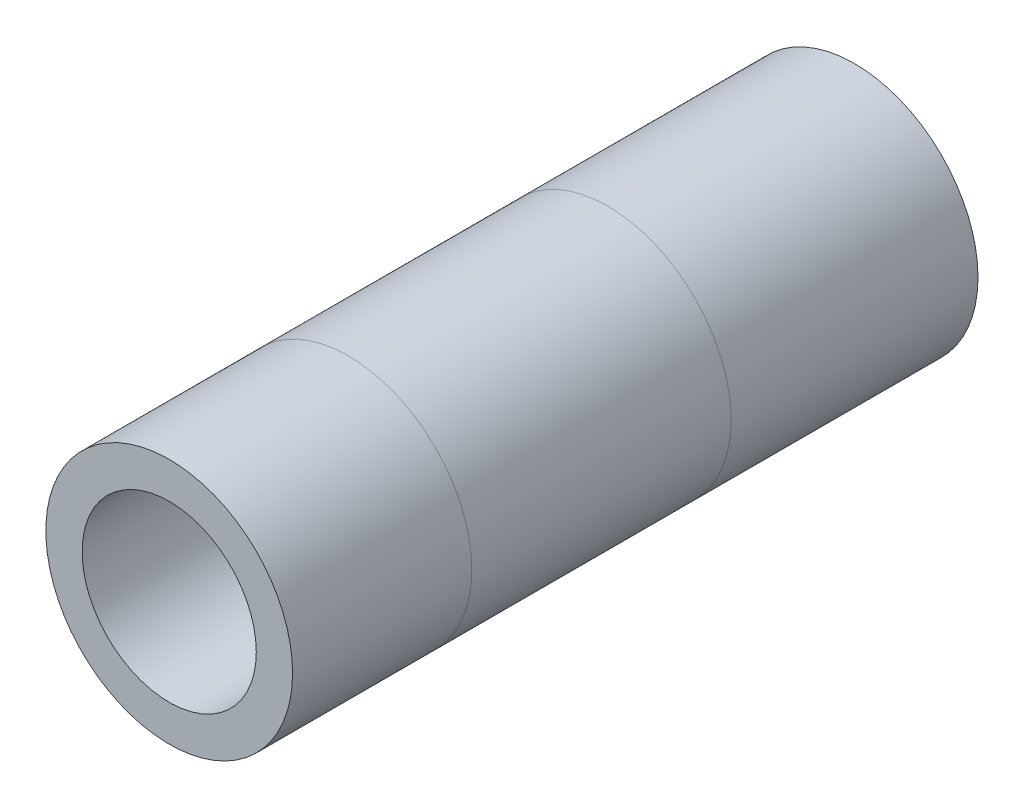
ISO-10303-21;
HEADER;
FILE_DESCRIPTION(('STEP AP214'),'2;1');
FILE_NAME('part.step','',(''),(''),'','','');
FILE_SCHEMA(('AUTOMOTIVE_DESIGN { 1 0 10303 214 1 1 1 1 }'));
ENDSEC;
DATA;
#1=APPLICATION_CONTEXT('core data for automotive mechanical design processes');
#2=APPLICATION_PROTOCOL_DEFINITION('international standard','automotive_design',2000,#1);
#3=PRODUCT_CONTEXT('',#1,'mechanical');
#4=PRODUCT('Part','Part','',(#3));
#5=PRODUCT_RELATED_PRODUCT_CATEGORY('part','',(#4));
#6=PRODUCT_DEFINITION_FORMATION('','',#4);
#7=PRODUCT_DEFINITION_CONTEXT('part definition',#1,'design');
#8=PRODUCT_DEFINITION('design','',#6,#7);
#9=PRODUCT_DEFINITION_SHAPE('','',#8);
#10=(LENGTH_UNIT() NAMED_UNIT(*) SI_UNIT(.MILLI.,.METRE.));
#11=(NAMED_UNIT(*) PLANE_ANGLE_UNIT() SI_UNIT($,.RADIAN.));
#12=(NAMED_UNIT(*) SI_UNIT($,.STERADIAN.) SOLID_ANGLE_UNIT());
#13=UNCERTAINTY_MEASURE_WITH_UNIT(LENGTH_MEASURE(1.E-05),#10,'distance_accuracy_value','');
#14=(GEOMETRIC_REPRESENTATION_CONTEXT(3) GLOBAL_UNCERTAINTY_ASSIGNED_CONTEXT((#13)) GLOBAL_UNIT_ASSIGNED_CONTEXT((#10,
#11,#12)) REPRESENTATION_CONTEXT('',''));
#15=CARTESIAN_POINT('',(0.,0.,0.));
#16=DIRECTION('',(0.,0.,1.));
#17=DIRECTION('',(1.,0.,0.));
#18=AXIS2_PLACEMENT_3D('',#15,#16,#17);
#19=CARTESIAN_POINT('',(23.5000000000002,72.9999999999999,-27.));
#20=DIRECTION('',(0.,0.,1.));
#21=DIRECTION('',(1.,0.,0.));
#22=AXIS2_PLACEMENT_3D('',#19,#20,#21);
#23=PLANE('',#22);
#24=CARTESIAN_POINT('',(23.5000000000002,72.9999999999999,-27.));
#25=DIRECTION('',(0.,0.,1.));
#26=DIRECTION('',(1.,0.,0.));
#27=AXIS2_PLACEMENT_3D('',#24,#25,#26);
#28=CIRCLE('',#27,9.525);
#29=CARTESIAN_POINT('',(33.0250000000002,72.9999999999999,-27.));
#30=VERTEX_POINT('',#29);
#31=EDGE_CURVE('E85',#30,#30,#28,.F.);
#32=ORIENTED_EDGE('',*,*,#31,.F.);
#33=EDGE_LOOP('',(#32));
#34=FACE_BOUND('',#33,.T.);
#35=CARTESIAN_POINT('',(23.5000000000002,72.9999999999999,-27.));
#36=DIRECTION('',(0.,0.,1.));
#37=DIRECTION('',(1.,0.,0.));
#38=AXIS2_PLACEMENT_3D('',#35,#36,#37);
#39=CIRCLE('',#38,13.49375);
#40=CARTESIAN_POINT('',(36.9937500000002,72.9999999999999,-27.));
#41=VERTEX_POINT('',#40);
#42=EDGE_CURVE('E63',#41,#41,#39,.T.);
#43=ORIENTED_EDGE('',*,*,#42,.F.);
#44=EDGE_LOOP('',(#43));
#45=FACE_BOUND('',#44,.T.);
#46=ADVANCED_FACE('F60',(#34,#45),#23,.F.);
#47=CARTESIAN_POINT('',(23.5000000000001,72.9999999914589,47.9735795162963));
#48=DIRECTION('',(0.,0.,1.));
#49=DIRECTION('',(1.,0.,0.));
#50=AXIS2_PLACEMENT_3D('',#47,#48,#49);
#51=PLANE('',#50);
#52=CARTESIAN_POINT('',(23.5000000000001,72.9999999914589,47.9735795162963));
#53=DIRECTION('',(0.,0.,1.));
#54=DIRECTION('',(1.,0.,0.));
#55=AXIS2_PLACEMENT_3D('',#52,#53,#54);
#56=CIRCLE('',#55,9.525);
#57=CARTESIAN_POINT('',(33.0250000000001,72.9999999914589,47.9735795162963));
#58=VERTEX_POINT('',#57);
#59=EDGE_CURVE('E98',#58,#58,#56,.F.);
#60=ORIENTED_EDGE('',*,*,#59,.T.);
#61=EDGE_LOOP('',(#60));
#62=FACE_BOUND('',#61,.T.);
#63=CARTESIAN_POINT('',(23.5000000000001,72.9999999914589,47.9735795162963));
#64=DIRECTION('',(0.,0.,1.));
#65=DIRECTION('',(1.,0.,0.));
#66=AXIS2_PLACEMENT_3D('',#63,#64,#65);
#67=CIRCLE('',#66,13.49375);
#68=CARTESIAN_POINT('',(36.9937500000001,72.9999999914589,47.9735795162963));
#69=VERTEX_POINT('',#68);
#70=EDGE_CURVE('E68',#69,#69,#67,.T.);
#71=ORIENTED_EDGE('',*,*,#70,.T.);
#72=EDGE_LOOP('',(#71));
#73=FACE_BOUND('',#72,.T.);
#74=ADVANCED_FACE('F109',(#62,#73),#51,.T.);
#75=CARTESIAN_POINT('',(23.5000000000002,72.9999999999999,0.));
#76=DIRECTION('',(0.,0.,-1.));
#77=DIRECTION('',(-1.,0.,0.));
#78=AXIS2_PLACEMENT_3D('',#75,#76,#77);
#79=CYLINDRICAL_SURFACE('',#78,13.49375);
#80=ORIENTED_EDGE('',*,*,#42,.T.);
#81=EDGE_LOOP('',(#80));
#82=FACE_BOUND('',#81,.T.);
#83=CARTESIAN_POINT('',(23.5000000000002,72.9999999999999,0.));
#84=DIRECTION('',(0.,-3.01035787396165E-10,1.));
#85=DIRECTION('',(1.,0.,0.));
#86=AXIS2_PLACEMENT_3D('',#83,#84,#85);
#87=CIRCLE('',#86,13.49375);
#88=CARTESIAN_POINT('',(36.9937500000002,72.9999999999999,0.));
#89=VERTEX_POINT('',#88);
#90=EDGE_CURVE('E75',#89,#89,#87,.T.);
#91=ORIENTED_EDGE('',*,*,#90,.F.);
#92=EDGE_LOOP('',(#91));
#93=FACE_BOUND('',#92,.T.);
#94=ADVANCED_FACE('F135',(#82,#93),#79,.T.);
#95=CARTESIAN_POINT('',(23.5000000000002,72.9999999914589,28.3720000059819));
#96=DIRECTION('',(0.,3.01035787396165E-10,-1.));
#97=DIRECTION('',(0.,1.,3.01035787396165E-10));
#98=AXIS2_PLACEMENT_3D('',#95,#96,#97);
#99=CYLINDRICAL_SURFACE('',#98,13.49375);
#100=ORIENTED_EDGE('',*,*,#90,.T.);
#101=EDGE_LOOP('',(#100));
#102=FACE_BOUND('',#101,.T.);
#103=CARTESIAN_POINT('',(23.5000000000001,72.9999999914589,28.3720000059819));
#104=DIRECTION('',(0.,0.,1.));
#105=DIRECTION('',(1.,0.,0.));
#106=AXIS2_PLACEMENT_3D('',#103,#104,#105);
#107=CIRCLE('',#106,13.49375);
#108=CARTESIAN_POINT('',(36.9937500000001,72.9999999914589,28.3720000059819));
#109=VERTEX_POINT('',#108);
#110=EDGE_CURVE('E11',#109,#109,#107,.T.);
#111=ORIENTED_EDGE('',*,*,#110,.F.);
#112=EDGE_LOOP('',(#111));
#113=FACE_BOUND('',#112,.T.);
#114=ADVANCED_FACE('F125',(#102,#113),#99,.T.);
#115=CARTESIAN_POINT('',(23.5000000000001,72.9999999914589,47.9735795162963));
#116=DIRECTION('',(0.,0.,-1.));
#117=DIRECTION('',(-1.,0.,0.));
#118=AXIS2_PLACEMENT_3D('',#115,#116,#117);
#119=CYLINDRICAL_SURFACE('',#118,13.49375);
#120=ORIENTED_EDGE('',*,*,#110,.T.);
#121=EDGE_LOOP('',(#120));
#122=FACE_BOUND('',#121,.T.);
#123=ORIENTED_EDGE('',*,*,#70,.F.);
#124=EDGE_LOOP('',(#123));
#125=FACE_BOUND('',#124,.T.);
#126=ADVANCED_FACE('F115',(#122,#125),#119,.T.);
#127=CARTESIAN_POINT('',(23.5000000000001,72.9999999914589,28.3720000059819));
#128=DIRECTION('',(0.,0.,1.));
#129=DIRECTION('',(1.,0.,0.));
#130=AXIS2_PLACEMENT_3D('',#127,#128,#129);
#131=CYLINDRICAL_SURFACE('',#130,9.525);
#132=CARTESIAN_POINT('',(23.5000000000002,72.9999999914589,28.3720000059819));
#133=DIRECTION('',(0.,-3.01035787396165E-10,1.));
#134=DIRECTION('',(1.,0.,0.));
#135=AXIS2_PLACEMENT_3D('',#132,#133,#134);
#136=CIRCLE('',#135,9.525);
#137=CARTESIAN_POINT('',(33.0250000000002,72.9999999914589,28.3720000059819));
#138=VERTEX_POINT('',#137);
#139=EDGE_CURVE('E101',#138,#138,#136,.T.);
#140=ORIENTED_EDGE('',*,*,#139,.F.);
#141=EDGE_LOOP('',(#140));
#142=FACE_BOUND('',#141,.T.);
#143=ORIENTED_EDGE('',*,*,#59,.F.);
#144=EDGE_LOOP('',(#143));
#145=FACE_BOUND('',#144,.T.);
#146=ADVANCED_FACE('F112',(#142,#145),#131,.F.);
#147=CARTESIAN_POINT('',(23.5000000000002,72.9999999999999,0.));
#148=DIRECTION('',(0.,-3.01035787396165E-10,1.));
#149=DIRECTION('',(0.,-1.,-3.01035787396165E-10));
#150=AXIS2_PLACEMENT_3D('',#147,#148,#149);
#151=CYLINDRICAL_SURFACE('',#150,9.525);
#152=ORIENTED_EDGE('',*,*,#139,.T.);
#153=EDGE_LOOP('',(#152));
#154=FACE_BOUND('',#153,.T.);
#155=CARTESIAN_POINT('',(23.5000000000002,72.9999999999999,0.));
#156=DIRECTION('',(0.,0.,1.));
#157=DIRECTION('',(1.,0.,0.));
#158=AXIS2_PLACEMENT_3D('',#155,#156,#157);
#159=CIRCLE('',#158,9.525);
#160=CARTESIAN_POINT('',(33.0250000000002,72.9999999999999,0.));
#161=VERTEX_POINT('',#160);
#162=EDGE_CURVE('E91',#161,#161,#159,.T.);
#163=ORIENTED_EDGE('',*,*,#162,.F.);
#164=EDGE_LOOP('',(#163));
#165=FACE_BOUND('',#164,.T.);
#166=ADVANCED_FACE('F114',(#154,#165),#151,.F.);
#167=CARTESIAN_POINT('',(23.5000000000002,72.9999999999999,-28.));
#168=DIRECTION('',(0.,0.,1.));
#169=DIRECTION('',(1.,0.,0.));
#170=AXIS2_PLACEMENT_3D('',#167,#168,#169);
#171=CYLINDRICAL_SURFACE('',#170,9.525);
#172=ORIENTED_EDGE('',*,*,#31,.T.);
#173=EDGE_LOOP('',(#172));
#174=FACE_BOUND('',#173,.T.);
#175=ORIENTED_EDGE('',*,*,#162,.T.);
#176=EDGE_LOOP('',(#175));
#177=FACE_BOUND('',#176,.T.);
#178=ADVANCED_FACE('F118',(#174,#177),#171,.F.);
#179=CLOSED_SHELL('',(#46,#74,#94,#114,#126,#146,#166,#178));
#180=MANIFOLD_SOLID_BREP('B2',#179);
#181=ADVANCED_BREP_SHAPE_REPRESENTATION('',(#18,#180),#14);
#182=SHAPE_DEFINITION_REPRESENTATION(#9,#181);
ENDSEC;
END-ISO-10303-21;
